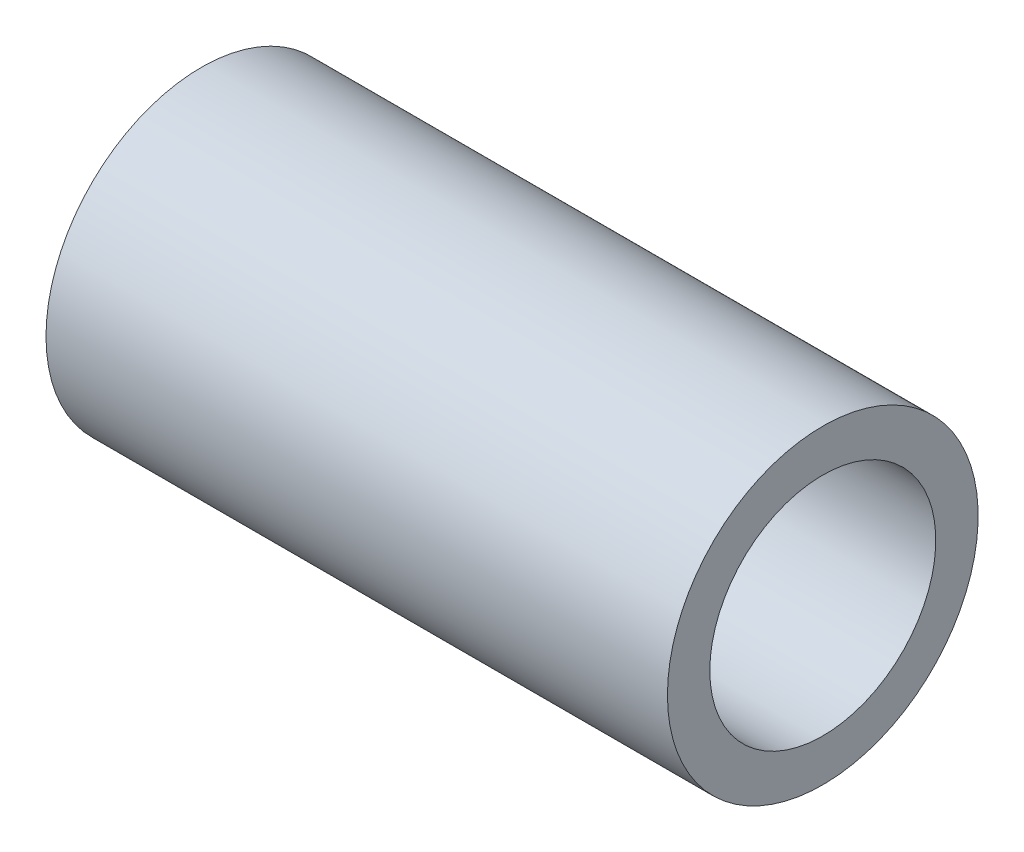
ISO-10303-21;
HEADER;
FILE_DESCRIPTION(('STEP AP214'),'2;1');
FILE_NAME('part.step','',(''),(''),'','','');
FILE_SCHEMA(('AUTOMOTIVE_DESIGN { 1 0 10303 214 1 1 1 1 }'));
ENDSEC;
DATA;
#1=APPLICATION_CONTEXT('core data for automotive mechanical design processes');
#2=APPLICATION_PROTOCOL_DEFINITION('international standard','automotive_design',2000,#1);
#3=PRODUCT_CONTEXT('',#1,'mechanical');
#4=PRODUCT('Part','Part','',(#3));
#5=PRODUCT_RELATED_PRODUCT_CATEGORY('part','',(#4));
#6=PRODUCT_DEFINITION_FORMATION('','',#4);
#7=PRODUCT_DEFINITION_CONTEXT('part definition',#1,'design');
#8=PRODUCT_DEFINITION('design','',#6,#7);
#9=PRODUCT_DEFINITION_SHAPE('','',#8);
#10=(LENGTH_UNIT() NAMED_UNIT(*) SI_UNIT(.MILLI.,.METRE.));
#11=(NAMED_UNIT(*) PLANE_ANGLE_UNIT() SI_UNIT($,.RADIAN.));
#12=(NAMED_UNIT(*) SI_UNIT($,.STERADIAN.) SOLID_ANGLE_UNIT());
#13=UNCERTAINTY_MEASURE_WITH_UNIT(LENGTH_MEASURE(1.E-05),#10,'distance_accuracy_value','');
#14=(GEOMETRIC_REPRESENTATION_CONTEXT(3) GLOBAL_UNCERTAINTY_ASSIGNED_CONTEXT((#13)) GLOBAL_UNIT_ASSIGNED_CONTEXT((#10,
#11,#12)) REPRESENTATION_CONTEXT('',''));
#15=CARTESIAN_POINT('',(0.,0.,0.));
#16=DIRECTION('',(0.,0.,1.));
#17=DIRECTION('',(1.,0.,0.));
#18=AXIS2_PLACEMENT_3D('',#15,#16,#17);
#19=CARTESIAN_POINT('',(0.,4.,0.));
#20=DIRECTION('',(1.,0.,0.));
#21=DIRECTION('',(0.,0.,-1.));
#22=AXIS2_PLACEMENT_3D('',#19,#20,#21);
#23=PLANE('',#22);
#24=CARTESIAN_POINT('',(0.,0.,0.));
#25=DIRECTION('',(-1.,0.,0.));
#26=DIRECTION('',(0.,0.,1.));
#27=AXIS2_PLACEMENT_3D('',#24,#25,#26);
#28=CIRCLE('',#27,4.);
#29=CARTESIAN_POINT('',(0.,0.,4.));
#30=VERTEX_POINT('',#29);
#31=EDGE_CURVE('E48',#30,#30,#28,.T.);
#32=ORIENTED_EDGE('',*,*,#31,.F.);
#33=EDGE_LOOP('',(#32));
#34=FACE_BOUND('',#33,.T.);
#35=CARTESIAN_POINT('',(0.,0.,0.));
#36=DIRECTION('',(-1.,0.,0.));
#37=DIRECTION('',(0.,0.,1.));
#38=AXIS2_PLACEMENT_3D('',#35,#36,#37);
#39=CIRCLE('',#38,5.5);
#40=CARTESIAN_POINT('',(0.,0.,5.5));
#41=VERTEX_POINT('',#40);
#42=EDGE_CURVE('E10',#41,#41,#39,.T.);
#43=ORIENTED_EDGE('',*,*,#42,.T.);
#44=EDGE_LOOP('',(#43));
#45=FACE_BOUND('',#44,.T.);
#46=ADVANCED_FACE('F34',(#34,#45),#23,.F.);
#47=CARTESIAN_POINT('',(0.,0.,0.));
#48=DIRECTION('',(-1.,0.,0.));
#49=DIRECTION('',(0.,0.,1.));
#50=AXIS2_PLACEMENT_3D('',#47,#48,#49);
#51=CYLINDRICAL_SURFACE('',#50,5.5);
#52=ORIENTED_EDGE('',*,*,#42,.F.);
#53=EDGE_LOOP('',(#52));
#54=FACE_BOUND('',#53,.T.);
#55=CARTESIAN_POINT('',(22.,0.,0.));
#56=DIRECTION('',(-1.,0.,0.));
#57=DIRECTION('',(0.,0.,1.));
#58=AXIS2_PLACEMENT_3D('',#55,#56,#57);
#59=CIRCLE('',#58,5.5);
#60=CARTESIAN_POINT('',(22.,0.,5.5));
#61=VERTEX_POINT('',#60);
#62=EDGE_CURVE('E40',#61,#61,#59,.T.);
#63=ORIENTED_EDGE('',*,*,#62,.T.);
#64=EDGE_LOOP('',(#63));
#65=FACE_BOUND('',#64,.T.);
#66=ADVANCED_FACE('F57',(#54,#65),#51,.T.);
#67=CARTESIAN_POINT('',(22.,4.,0.));
#68=DIRECTION('',(-1.,0.,0.));
#69=DIRECTION('',(0.,0.,1.));
#70=AXIS2_PLACEMENT_3D('',#67,#68,#69);
#71=PLANE('',#70);
#72=ORIENTED_EDGE('',*,*,#62,.F.);
#73=EDGE_LOOP('',(#72));
#74=FACE_BOUND('',#73,.T.);
#75=CARTESIAN_POINT('',(22.,0.,0.));
#76=DIRECTION('',(-1.,0.,0.));
#77=DIRECTION('',(0.,0.,1.));
#78=AXIS2_PLACEMENT_3D('',#75,#76,#77);
#79=CIRCLE('',#78,4.);
#80=CARTESIAN_POINT('',(22.,0.,4.));
#81=VERTEX_POINT('',#80);
#82=EDGE_CURVE('E44',#81,#81,#79,.T.);
#83=ORIENTED_EDGE('',*,*,#82,.T.);
#84=EDGE_LOOP('',(#83));
#85=FACE_BOUND('',#84,.T.);
#86=ADVANCED_FACE('F61',(#74,#85),#71,.F.);
#87=CARTESIAN_POINT('',(0.,0.,0.));
#88=DIRECTION('',(-1.,0.,0.));
#89=DIRECTION('',(0.,0.,1.));
#90=AXIS2_PLACEMENT_3D('',#87,#88,#89);
#91=CYLINDRICAL_SURFACE('',#90,4.);
#92=ORIENTED_EDGE('',*,*,#82,.F.);
#93=EDGE_LOOP('',(#92));
#94=FACE_BOUND('',#93,.T.);
#95=ORIENTED_EDGE('',*,*,#31,.T.);
#96=EDGE_LOOP('',(#95));
#97=FACE_BOUND('',#96,.T.);
#98=ADVANCED_FACE('F54',(#94,#97),#91,.F.);
#99=CLOSED_SHELL('',(#46,#66,#86,#98));
#100=MANIFOLD_SOLID_BREP('B2',#99);
#101=ADVANCED_BREP_SHAPE_REPRESENTATION('',(#18,#100),#14);
#102=SHAPE_DEFINITION_REPRESENTATION(#9,#101);
ENDSEC;
END-ISO-10303-21;
